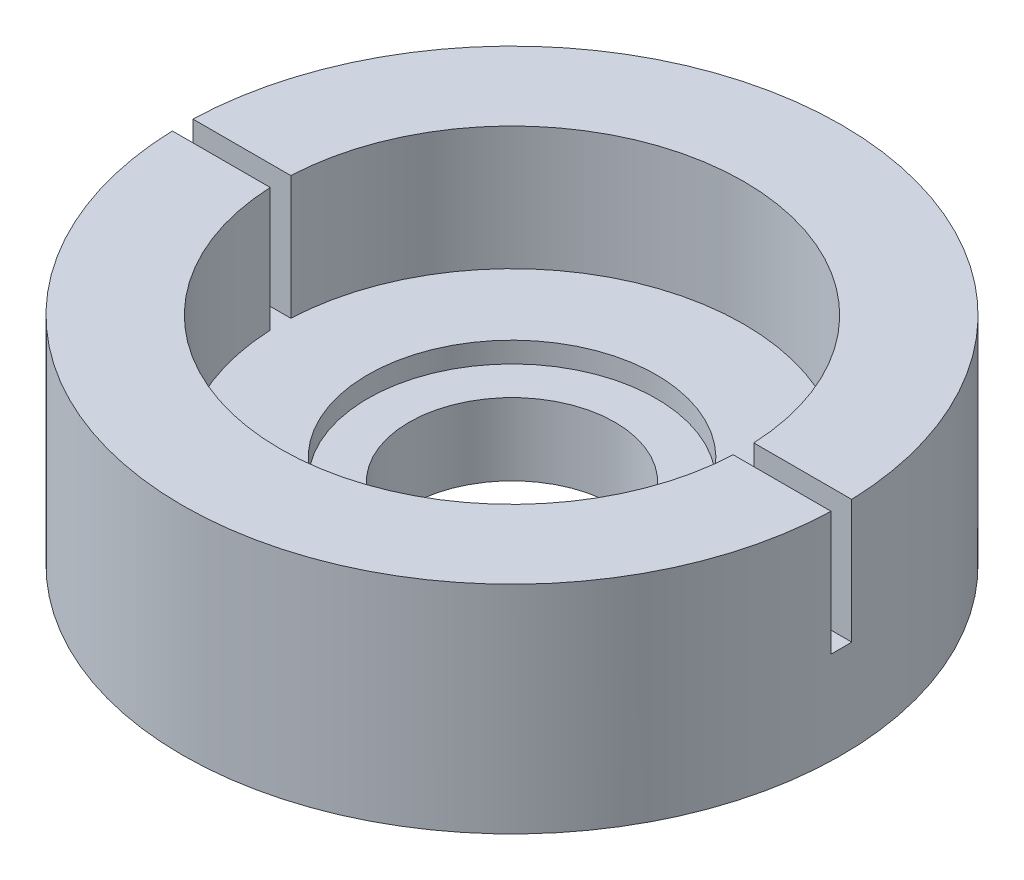
ISO-10303-21;
HEADER;
FILE_DESCRIPTION(('STEP AP214'),'2;1');
FILE_NAME('part.step','',(''),(''),'','','');
FILE_SCHEMA(('AUTOMOTIVE_DESIGN { 1 0 10303 214 1 1 1 1 }'));
ENDSEC;
DATA;
#1=APPLICATION_CONTEXT('core data for automotive mechanical design processes');
#2=APPLICATION_PROTOCOL_DEFINITION('international standard','automotive_design',2000,#1);
#3=PRODUCT_CONTEXT('',#1,'mechanical');
#4=PRODUCT('Part','Part','',(#3));
#5=PRODUCT_RELATED_PRODUCT_CATEGORY('part','',(#4));
#6=PRODUCT_DEFINITION_FORMATION('','',#4);
#7=PRODUCT_DEFINITION_CONTEXT('part definition',#1,'design');
#8=PRODUCT_DEFINITION('design','',#6,#7);
#9=PRODUCT_DEFINITION_SHAPE('','',#8);
#10=(LENGTH_UNIT() NAMED_UNIT(*) SI_UNIT(.MILLI.,.METRE.));
#11=(NAMED_UNIT(*) PLANE_ANGLE_UNIT() SI_UNIT($,.RADIAN.));
#12=(NAMED_UNIT(*) SI_UNIT($,.STERADIAN.) SOLID_ANGLE_UNIT());
#13=UNCERTAINTY_MEASURE_WITH_UNIT(LENGTH_MEASURE(1.E-05),#10,'distance_accuracy_value','');
#14=(GEOMETRIC_REPRESENTATION_CONTEXT(3) GLOBAL_UNCERTAINTY_ASSIGNED_CONTEXT((#13)) GLOBAL_UNIT_ASSIGNED_CONTEXT((#10,
#11,#12)) REPRESENTATION_CONTEXT('',''));
#15=CARTESIAN_POINT('',(0.,0.,0.));
#16=DIRECTION('',(0.,0.,1.));
#17=DIRECTION('',(1.,0.,0.));
#18=AXIS2_PLACEMENT_3D('',#15,#16,#17);
#19=CARTESIAN_POINT('',(0.,10.5,0.));
#20=DIRECTION('',(0.,1.,0.));
#21=DIRECTION('',(0.,0.,1.));
#22=AXIS2_PLACEMENT_3D('',#19,#20,#21);
#23=PLANE('',#22);
#24=DIRECTION('',(1.,0.,0.));
#25=VECTOR('',#24,1.);
#26=CARTESIAN_POINT('',(-16.,10.5,0.5));
#27=LINE('',#26,#25);
#28=CARTESIAN_POINT('',(-15.9921855917195,10.5,0.5));
#29=VERTEX_POINT('',#28);
#30=CARTESIAN_POINT('',(-11.2388833964945,10.5,0.5));
#31=VERTEX_POINT('',#30);
#32=EDGE_CURVE('E191',#29,#31,#27,.T.);
#33=ORIENTED_EDGE('',*,*,#32,.F.);
#34=CARTESIAN_POINT('',(0.,10.5,0.));
#35=DIRECTION('',(0.,1.,0.));
#36=DIRECTION('',(0.,0.,1.));
#37=AXIS2_PLACEMENT_3D('',#34,#35,#36);
#38=CIRCLE('',#37,16.);
#39=CARTESIAN_POINT('',(15.9921855917195,10.5,0.5));
#40=VERTEX_POINT('',#39);
#41=EDGE_CURVE('E131',#29,#40,#38,.T.);
#42=ORIENTED_EDGE('',*,*,#41,.T.);
#43=CARTESIAN_POINT('',(11.2388833964945,10.5,0.5));
#44=VERTEX_POINT('',#43);
#45=EDGE_CURVE('E193',#44,#40,#27,.T.);
#46=ORIENTED_EDGE('',*,*,#45,.F.);
#47=CARTESIAN_POINT('',(0.,10.5,0.));
#48=DIRECTION('',(0.,1.,0.));
#49=DIRECTION('',(0.,0.,1.));
#50=AXIS2_PLACEMENT_3D('',#47,#48,#49);
#51=CIRCLE('',#50,11.25);
#52=EDGE_CURVE('E123',#31,#44,#51,.T.);
#53=ORIENTED_EDGE('',*,*,#52,.F.);
#54=EDGE_LOOP('',(#33,#42,#46,#53));
#55=FACE_BOUND('',#54,.T.);
#56=ADVANCED_FACE('F33',(#55),#23,.T.);
#57=CARTESIAN_POINT('',(0.,10.5,0.));
#58=DIRECTION('',(0.,-1.,0.));
#59=DIRECTION('',(0.,0.,-1.));
#60=AXIS2_PLACEMENT_3D('',#57,#58,#59);
#61=CYLINDRICAL_SURFACE('',#60,11.25);
#62=DIRECTION('',(0.,-1.,0.));
#63=VECTOR('',#62,1.);
#64=CARTESIAN_POINT('',(-11.2388833964945,10.5,0.5));
#65=LINE('',#64,#63);
#66=CARTESIAN_POINT('',(-11.2388833964945,4.5,0.5));
#67=VERTEX_POINT('',#66);
#68=EDGE_CURVE('E173',#31,#67,#65,.T.);
#69=ORIENTED_EDGE('',*,*,#68,.F.);
#70=ORIENTED_EDGE('',*,*,#52,.T.);
#71=DIRECTION('',(0.,-1.,0.));
#72=VECTOR('',#71,1.);
#73=CARTESIAN_POINT('',(11.2388833964945,10.5,0.5));
#74=LINE('',#73,#72);
#75=CARTESIAN_POINT('',(11.2388833964945,4.5,0.5));
#76=VERTEX_POINT('',#75);
#77=EDGE_CURVE('E175',#76,#44,#74,.F.);
#78=ORIENTED_EDGE('',*,*,#77,.F.);
#79=CARTESIAN_POINT('',(0.,4.5,0.));
#80=DIRECTION('',(0.,1.,0.));
#81=DIRECTION('',(0.,0.,1.));
#82=AXIS2_PLACEMENT_3D('',#79,#80,#81);
#83=CIRCLE('',#82,11.25);
#84=EDGE_CURVE('E37',#76,#67,#83,.F.);
#85=ORIENTED_EDGE('',*,*,#84,.T.);
#86=EDGE_LOOP('',(#69,#70,#78,#85));
#87=FACE_BOUND('',#86,.T.);
#88=ADVANCED_FACE('F172',(#87),#61,.F.);
#89=CARTESIAN_POINT('',(0.,0.,0.));
#90=DIRECTION('',(0.,1.,0.));
#91=DIRECTION('',(0.,0.,1.));
#92=AXIS2_PLACEMENT_3D('',#89,#90,#91);
#93=PLANE('',#92);
#94=CARTESIAN_POINT('',(0.,0.,0.));
#95=DIRECTION('',(0.,1.,0.));
#96=DIRECTION('',(0.,0.,1.));
#97=AXIS2_PLACEMENT_3D('',#94,#95,#96);
#98=CIRCLE('',#97,16.);
#99=CARTESIAN_POINT('',(0.,0.,16.));
#100=VERTEX_POINT('',#99);
#101=EDGE_CURVE('E165',#100,#100,#98,.T.);
#102=ORIENTED_EDGE('',*,*,#101,.F.);
#103=EDGE_LOOP('',(#102));
#104=FACE_BOUND('',#103,.T.);
#105=CARTESIAN_POINT('',(0.,0.,0.));
#106=DIRECTION('',(0.,1.,0.));
#107=DIRECTION('',(0.,0.,1.));
#108=AXIS2_PLACEMENT_3D('',#105,#106,#107);
#109=CIRCLE('',#108,5.);
#110=CARTESIAN_POINT('',(0.,0.,5.));
#111=VERTEX_POINT('',#110);
#112=EDGE_CURVE('E159',#111,#111,#109,.T.);
#113=ORIENTED_EDGE('',*,*,#112,.T.);
#114=EDGE_LOOP('',(#113));
#115=FACE_BOUND('',#114,.T.);
#116=CARTESIAN_POINT('',(0.,0.,-12.5));
#117=DIRECTION('',(0.,1.,0.));
#118=DIRECTION('',(0.,0.,1.));
#119=AXIS2_PLACEMENT_3D('',#116,#117,#118);
#120=CIRCLE('',#119,1.975);
#121=CARTESIAN_POINT('',(0.,0.,-10.525));
#122=VERTEX_POINT('',#121);
#123=EDGE_CURVE('E154',#122,#122,#120,.T.);
#124=ORIENTED_EDGE('',*,*,#123,.T.);
#125=EDGE_LOOP('',(#124));
#126=FACE_BOUND('',#125,.T.);
#127=CARTESIAN_POINT('',(12.5,0.,0.));
#128=DIRECTION('',(0.,1.,0.));
#129=DIRECTION('',(0.,0.,1.));
#130=AXIS2_PLACEMENT_3D('',#127,#128,#129);
#131=CIRCLE('',#130,1.975);
#132=CARTESIAN_POINT('',(12.5,0.,1.975));
#133=VERTEX_POINT('',#132);
#134=EDGE_CURVE('E149',#133,#133,#131,.T.);
#135=ORIENTED_EDGE('',*,*,#134,.T.);
#136=EDGE_LOOP('',(#135));
#137=FACE_BOUND('',#136,.T.);
#138=CARTESIAN_POINT('',(0.,0.,12.5));
#139=DIRECTION('',(0.,1.,0.));
#140=DIRECTION('',(0.,0.,1.));
#141=AXIS2_PLACEMENT_3D('',#138,#139,#140);
#142=CIRCLE('',#141,1.975);
#143=CARTESIAN_POINT('',(0.,0.,14.475));
#144=VERTEX_POINT('',#143);
#145=EDGE_CURVE('E142',#144,#144,#142,.T.);
#146=ORIENTED_EDGE('',*,*,#145,.T.);
#147=EDGE_LOOP('',(#146));
#148=FACE_BOUND('',#147,.T.);
#149=CARTESIAN_POINT('',(-12.5,0.,0.));
#150=DIRECTION('',(0.,1.,0.));
#151=DIRECTION('',(0.,0.,1.));
#152=AXIS2_PLACEMENT_3D('',#149,#150,#151);
#153=CIRCLE('',#152,1.975);
#154=CARTESIAN_POINT('',(-12.5,0.,1.975));
#155=VERTEX_POINT('',#154);
#156=EDGE_CURVE('E139',#155,#155,#153,.T.);
#157=ORIENTED_EDGE('',*,*,#156,.T.);
#158=EDGE_LOOP('',(#157));
#159=FACE_BOUND('',#158,.T.);
#160=ADVANCED_FACE('F223',(#104,#115,#126,#137,#148,#159),#93,.F.);
#161=CARTESIAN_POINT('',(0.,3.5,0.));
#162=DIRECTION('',(0.,-1.,0.));
#163=DIRECTION('',(0.,0.,-1.));
#164=AXIS2_PLACEMENT_3D('',#161,#162,#163);
#165=CYLINDRICAL_SURFACE('',#164,16.);
#166=CARTESIAN_POINT('',(0.,4.5,0.));
#167=DIRECTION('',(0.,1.,0.));
#168=DIRECTION('',(0.,0.,1.));
#169=AXIS2_PLACEMENT_3D('',#166,#167,#168);
#170=CIRCLE('',#169,16.);
#171=CARTESIAN_POINT('',(15.9921855917195,4.5,0.5));
#172=VERTEX_POINT('',#171);
#173=CARTESIAN_POINT('',(15.9921855917195,4.5,-0.5));
#174=VERTEX_POINT('',#173);
#175=EDGE_CURVE('E121',#172,#174,#170,.T.);
#176=ORIENTED_EDGE('',*,*,#175,.F.);
#177=DIRECTION('',(0.,-1.,0.));
#178=VECTOR('',#177,1.);
#179=CARTESIAN_POINT('',(15.9921855917195,3.5,0.5));
#180=LINE('',#179,#178);
#181=EDGE_CURVE('E124',#172,#40,#180,.F.);
#182=ORIENTED_EDGE('',*,*,#181,.T.);
#183=ORIENTED_EDGE('',*,*,#41,.F.);
#184=DIRECTION('',(0.,-1.,0.));
#185=VECTOR('',#184,1.);
#186=CARTESIAN_POINT('',(-15.9921855917195,3.5,0.5));
#187=LINE('',#186,#185);
#188=CARTESIAN_POINT('',(-15.9921855917195,4.5,0.5));
#189=VERTEX_POINT('',#188);
#190=EDGE_CURVE('E120',#29,#189,#187,.T.);
#191=ORIENTED_EDGE('',*,*,#190,.T.);
#192=CARTESIAN_POINT('',(-15.9921855917195,4.5,-0.5));
#193=VERTEX_POINT('',#192);
#194=EDGE_CURVE('E113',#193,#189,#170,.T.);
#195=ORIENTED_EDGE('',*,*,#194,.F.);
#196=DIRECTION('',(0.,-1.,0.));
#197=VECTOR('',#196,1.);
#198=CARTESIAN_POINT('',(-15.9921855917195,3.5,-0.5));
#199=LINE('',#198,#197);
#200=CARTESIAN_POINT('',(-15.9921855917195,10.5,-0.5));
#201=VERTEX_POINT('',#200);
#202=EDGE_CURVE('E98',#193,#201,#199,.F.);
#203=ORIENTED_EDGE('',*,*,#202,.T.);
#204=CARTESIAN_POINT('',(15.9921855917195,10.5,-0.5));
#205=VERTEX_POINT('',#204);
#206=EDGE_CURVE('E134',#205,#201,#38,.T.);
#207=ORIENTED_EDGE('',*,*,#206,.F.);
#208=DIRECTION('',(0.,-1.,0.));
#209=VECTOR('',#208,1.);
#210=CARTESIAN_POINT('',(15.9921855917195,3.5,-0.5));
#211=LINE('',#210,#209);
#212=EDGE_CURVE('E109',#205,#174,#211,.T.);
#213=ORIENTED_EDGE('',*,*,#212,.T.);
#214=EDGE_LOOP('',(#176,#182,#183,#191,#195,#203,#207,#213));
#215=FACE_BOUND('',#214,.T.);
#216=ORIENTED_EDGE('',*,*,#101,.T.);
#217=EDGE_LOOP('',(#216));
#218=FACE_BOUND('',#217,.T.);
#219=ADVANCED_FACE('F35',(#215,#218),#165,.T.);
#220=CARTESIAN_POINT('',(0.,3.5,0.));
#221=DIRECTION('',(0.,-1.,0.));
#222=DIRECTION('',(0.,0.,-1.));
#223=AXIS2_PLACEMENT_3D('',#220,#221,#222);
#224=CYLINDRICAL_SURFACE('',#223,5.);
#225=CARTESIAN_POINT('',(0.,3.5,0.));
#226=DIRECTION('',(0.,1.,0.));
#227=DIRECTION('',(0.,0.,1.));
#228=AXIS2_PLACEMENT_3D('',#225,#226,#227);
#229=CIRCLE('',#228,5.);
#230=CARTESIAN_POINT('',(0.,3.5,5.));
#231=VERTEX_POINT('',#230);
#232=EDGE_CURVE('E160',#231,#231,#229,.T.);
#233=ORIENTED_EDGE('',*,*,#232,.T.);
#234=EDGE_LOOP('',(#233));
#235=FACE_BOUND('',#234,.T.);
#236=ORIENTED_EDGE('',*,*,#112,.F.);
#237=EDGE_LOOP('',(#236));
#238=FACE_BOUND('',#237,.T.);
#239=ADVANCED_FACE('F274',(#235,#238),#224,.F.);
#240=CARTESIAN_POINT('',(0.,3.5,-12.5));
#241=DIRECTION('',(0.,-1.,0.));
#242=DIRECTION('',(0.,0.,-1.));
#243=AXIS2_PLACEMENT_3D('',#240,#241,#242);
#244=CYLINDRICAL_SURFACE('',#243,1.975);
#245=CARTESIAN_POINT('',(0.,3.5,-12.5));
#246=DIRECTION('',(0.,1.,0.));
#247=DIRECTION('',(0.,0.,1.));
#248=AXIS2_PLACEMENT_3D('',#245,#246,#247);
#249=CIRCLE('',#248,1.975);
#250=CARTESIAN_POINT('',(0.,3.5,-10.525));
#251=VERTEX_POINT('',#250);
#252=EDGE_CURVE('E146',#251,#251,#249,.T.);
#253=ORIENTED_EDGE('',*,*,#252,.T.);
#254=EDGE_LOOP('',(#253));
#255=FACE_BOUND('',#254,.T.);
#256=ORIENTED_EDGE('',*,*,#123,.F.);
#257=EDGE_LOOP('',(#256));
#258=FACE_BOUND('',#257,.T.);
#259=ADVANCED_FACE('F270',(#255,#258),#244,.F.);
#260=CARTESIAN_POINT('',(12.5,3.5,0.));
#261=DIRECTION('',(0.,-1.,0.));
#262=DIRECTION('',(0.,0.,-1.));
#263=AXIS2_PLACEMENT_3D('',#260,#261,#262);
#264=CYLINDRICAL_SURFACE('',#263,1.975);
#265=CARTESIAN_POINT('',(12.5,3.5,0.));
#266=DIRECTION('',(0.,1.,0.));
#267=DIRECTION('',(0.,0.,1.));
#268=AXIS2_PLACEMENT_3D('',#265,#266,#267);
#269=CIRCLE('',#268,1.975);
#270=CARTESIAN_POINT('',(12.5,3.5,1.975));
#271=VERTEX_POINT('',#270);
#272=EDGE_CURVE('E138',#271,#271,#269,.T.);
#273=ORIENTED_EDGE('',*,*,#272,.T.);
#274=EDGE_LOOP('',(#273));
#275=FACE_BOUND('',#274,.T.);
#276=ORIENTED_EDGE('',*,*,#134,.F.);
#277=EDGE_LOOP('',(#276));
#278=FACE_BOUND('',#277,.T.);
#279=ADVANCED_FACE('F266',(#275,#278),#264,.F.);
#280=CARTESIAN_POINT('',(0.,3.5,12.5));
#281=DIRECTION('',(0.,-1.,0.));
#282=DIRECTION('',(0.,0.,-1.));
#283=AXIS2_PLACEMENT_3D('',#280,#281,#282);
#284=CYLINDRICAL_SURFACE('',#283,1.975);
#285=CARTESIAN_POINT('',(0.,3.5,12.5));
#286=DIRECTION('',(0.,1.,0.));
#287=DIRECTION('',(0.,0.,1.));
#288=AXIS2_PLACEMENT_3D('',#285,#286,#287);
#289=CIRCLE('',#288,1.975);
#290=CARTESIAN_POINT('',(0.,3.5,14.475));
#291=VERTEX_POINT('',#290);
#292=EDGE_CURVE('E143',#291,#291,#289,.T.);
#293=ORIENTED_EDGE('',*,*,#292,.T.);
#294=EDGE_LOOP('',(#293));
#295=FACE_BOUND('',#294,.T.);
#296=ORIENTED_EDGE('',*,*,#145,.F.);
#297=EDGE_LOOP('',(#296));
#298=FACE_BOUND('',#297,.T.);
#299=ADVANCED_FACE('F262',(#295,#298),#284,.F.);
#300=CARTESIAN_POINT('',(-12.5,3.5,0.));
#301=DIRECTION('',(0.,-1.,0.));
#302=DIRECTION('',(0.,0.,-1.));
#303=AXIS2_PLACEMENT_3D('',#300,#301,#302);
#304=CYLINDRICAL_SURFACE('',#303,1.975);
#305=CARTESIAN_POINT('',(-12.5,3.5,0.));
#306=DIRECTION('',(0.,1.,0.));
#307=DIRECTION('',(0.,0.,1.));
#308=AXIS2_PLACEMENT_3D('',#305,#306,#307);
#309=CIRCLE('',#308,1.975);
#310=CARTESIAN_POINT('',(-12.5,3.5,1.975));
#311=VERTEX_POINT('',#310);
#312=EDGE_CURVE('E135',#311,#311,#309,.T.);
#313=ORIENTED_EDGE('',*,*,#312,.T.);
#314=EDGE_LOOP('',(#313));
#315=FACE_BOUND('',#314,.T.);
#316=ORIENTED_EDGE('',*,*,#156,.F.);
#317=EDGE_LOOP('',(#316));
#318=FACE_BOUND('',#317,.T.);
#319=ADVANCED_FACE('F259',(#315,#318),#304,.F.);
#320=CARTESIAN_POINT('',(0.,3.5,0.));
#321=DIRECTION('',(0.,1.,0.));
#322=DIRECTION('',(0.,0.,1.));
#323=AXIS2_PLACEMENT_3D('',#320,#321,#322);
#324=PLANE('',#323);
#325=ORIENTED_EDGE('',*,*,#312,.F.);
#326=EDGE_LOOP('',(#325));
#327=FACE_BOUND('',#326,.T.);
#328=ADVANCED_FACE('F217',(#327),#324,.F.);
#329=ORIENTED_EDGE('',*,*,#272,.F.);
#330=EDGE_LOOP('',(#329));
#331=FACE_BOUND('',#330,.T.);
#332=ADVANCED_FACE('F341',(#331),#324,.F.);
#333=ORIENTED_EDGE('',*,*,#252,.F.);
#334=EDGE_LOOP('',(#333));
#335=FACE_BOUND('',#334,.T.);
#336=ADVANCED_FACE('F214',(#335),#324,.F.);
#337=ORIENTED_EDGE('',*,*,#292,.F.);
#338=EDGE_LOOP('',(#337));
#339=FACE_BOUND('',#338,.T.);
#340=ADVANCED_FACE('F207',(#339),#324,.F.);
#341=DIRECTION('',(-1.,0.,0.));
#342=VECTOR('',#341,1.);
#343=CARTESIAN_POINT('',(-16.,10.5,-0.5));
#344=LINE('',#343,#342);
#345=CARTESIAN_POINT('',(11.2388833964945,10.5,-0.5));
#346=VERTEX_POINT('',#345);
#347=EDGE_CURVE('E195',#205,#346,#344,.T.);
#348=ORIENTED_EDGE('',*,*,#347,.F.);
#349=ORIENTED_EDGE('',*,*,#206,.T.);
#350=CARTESIAN_POINT('',(-11.2388833964945,10.5,-0.5));
#351=VERTEX_POINT('',#350);
#352=EDGE_CURVE('E104',#351,#201,#344,.T.);
#353=ORIENTED_EDGE('',*,*,#352,.F.);
#354=EDGE_CURVE('E130',#346,#351,#51,.T.);
#355=ORIENTED_EDGE('',*,*,#354,.F.);
#356=EDGE_LOOP('',(#348,#349,#353,#355));
#357=FACE_BOUND('',#356,.T.);
#358=ADVANCED_FACE('F205',(#357),#23,.T.);
#359=DIRECTION('',(0.,-1.,0.));
#360=VECTOR('',#359,1.);
#361=CARTESIAN_POINT('',(11.2388833964945,10.5,-0.5));
#362=LINE('',#361,#360);
#363=CARTESIAN_POINT('',(11.2388833964945,4.5,-0.5));
#364=VERTEX_POINT('',#363);
#365=EDGE_CURVE('E110',#346,#364,#362,.T.);
#366=ORIENTED_EDGE('',*,*,#365,.F.);
#367=ORIENTED_EDGE('',*,*,#354,.T.);
#368=DIRECTION('',(0.,-1.,0.));
#369=VECTOR('',#368,1.);
#370=CARTESIAN_POINT('',(-11.2388833964945,10.5,-0.5));
#371=LINE('',#370,#369);
#372=CARTESIAN_POINT('',(-11.2388833964945,4.5,-0.5));
#373=VERTEX_POINT('',#372);
#374=EDGE_CURVE('E114',#373,#351,#371,.F.);
#375=ORIENTED_EDGE('',*,*,#374,.F.);
#376=EDGE_CURVE('E11',#373,#364,#83,.F.);
#377=ORIENTED_EDGE('',*,*,#376,.T.);
#378=EDGE_LOOP('',(#366,#367,#375,#377));
#379=FACE_BOUND('',#378,.T.);
#380=ADVANCED_FACE('F203',(#379),#61,.F.);
#381=CARTESIAN_POINT('',(0.,4.5,0.));
#382=DIRECTION('',(0.,1.,0.));
#383=DIRECTION('',(0.,0.,1.));
#384=AXIS2_PLACEMENT_3D('',#381,#382,#383);
#385=PLANE('',#384);
#386=CARTESIAN_POINT('',(0.,4.5,0.));
#387=DIRECTION('',(0.,1.,0.));
#388=DIRECTION('',(0.,0.,1.));
#389=AXIS2_PLACEMENT_3D('',#386,#387,#388);
#390=CIRCLE('',#389,7.);
#391=CARTESIAN_POINT('',(0.,4.5,7.));
#392=VERTEX_POINT('',#391);
#393=EDGE_CURVE('E247',#392,#392,#390,.T.);
#394=ORIENTED_EDGE('',*,*,#393,.F.);
#395=EDGE_LOOP('',(#394));
#396=FACE_BOUND('',#395,.T.);
#397=ORIENTED_EDGE('',*,*,#376,.F.);
#398=DIRECTION('',(1.,0.,0.));
#399=VECTOR('',#398,1.);
#400=CARTESIAN_POINT('',(-16.,4.5,-0.5));
#401=LINE('',#400,#399);
#402=EDGE_CURVE('E101',#193,#373,#401,.T.);
#403=ORIENTED_EDGE('',*,*,#402,.F.);
#404=ORIENTED_EDGE('',*,*,#194,.T.);
#405=DIRECTION('',(-1.,0.,0.));
#406=VECTOR('',#405,1.);
#407=CARTESIAN_POINT('',(-16.,4.5,0.5));
#408=LINE('',#407,#406);
#409=EDGE_CURVE('E55',#67,#189,#408,.T.);
#410=ORIENTED_EDGE('',*,*,#409,.F.);
#411=ORIENTED_EDGE('',*,*,#84,.F.);
#412=EDGE_CURVE('E177',#172,#76,#408,.T.);
#413=ORIENTED_EDGE('',*,*,#412,.F.);
#414=ORIENTED_EDGE('',*,*,#175,.T.);
#415=EDGE_CURVE('E48',#364,#174,#401,.T.);
#416=ORIENTED_EDGE('',*,*,#415,.F.);
#417=EDGE_LOOP('',(#397,#403,#404,#410,#411,#413,#414,#416));
#418=FACE_BOUND('',#417,.T.);
#419=ADVANCED_FACE('F112',(#396,#418),#385,.T.);
#420=CARTESIAN_POINT('',(-16.,-27.5156211871642,-0.5));
#421=DIRECTION('',(0.,0.,-1.));
#422=DIRECTION('',(-1.,0.,0.));
#423=AXIS2_PLACEMENT_3D('',#420,#421,#422);
#424=PLANE('',#423);
#425=ORIENTED_EDGE('',*,*,#402,.T.);
#426=ORIENTED_EDGE('',*,*,#374,.T.);
#427=ORIENTED_EDGE('',*,*,#352,.T.);
#428=ORIENTED_EDGE('',*,*,#202,.F.);
#429=EDGE_LOOP('',(#425,#426,#427,#428));
#430=FACE_BOUND('',#429,.T.);
#431=ADVANCED_FACE('F100',(#430),#424,.F.);
#432=CARTESIAN_POINT('',(-16.,-27.5156211871642,0.5));
#433=DIRECTION('',(0.,0.,1.));
#434=DIRECTION('',(1.,0.,0.));
#435=AXIS2_PLACEMENT_3D('',#432,#433,#434);
#436=PLANE('',#435);
#437=ORIENTED_EDGE('',*,*,#32,.T.);
#438=ORIENTED_EDGE('',*,*,#68,.T.);
#439=ORIENTED_EDGE('',*,*,#409,.T.);
#440=ORIENTED_EDGE('',*,*,#190,.F.);
#441=EDGE_LOOP('',(#437,#438,#439,#440));
#442=FACE_BOUND('',#441,.T.);
#443=ADVANCED_FACE('F189',(#442),#436,.F.);
#444=ORIENTED_EDGE('',*,*,#412,.T.);
#445=ORIENTED_EDGE('',*,*,#77,.T.);
#446=ORIENTED_EDGE('',*,*,#45,.T.);
#447=ORIENTED_EDGE('',*,*,#181,.F.);
#448=EDGE_LOOP('',(#444,#445,#446,#447));
#449=FACE_BOUND('',#448,.T.);
#450=ADVANCED_FACE('F232',(#449),#436,.F.);
#451=ORIENTED_EDGE('',*,*,#347,.T.);
#452=ORIENTED_EDGE('',*,*,#365,.T.);
#453=ORIENTED_EDGE('',*,*,#415,.T.);
#454=ORIENTED_EDGE('',*,*,#212,.F.);
#455=EDGE_LOOP('',(#451,#452,#453,#454));
#456=FACE_BOUND('',#455,.T.);
#457=ADVANCED_FACE('F199',(#456),#424,.F.);
#458=CARTESIAN_POINT('',(0.,3.5,0.));
#459=DIRECTION('',(0.,1.,0.));
#460=DIRECTION('',(0.,0.,1.));
#461=AXIS2_PLACEMENT_3D('',#458,#459,#460);
#462=CYLINDRICAL_SURFACE('',#461,7.);
#463=CARTESIAN_POINT('',(0.,3.5,0.));
#464=DIRECTION('',(0.,1.,0.));
#465=DIRECTION('',(0.,0.,1.));
#466=AXIS2_PLACEMENT_3D('',#463,#464,#465);
#467=CIRCLE('',#466,7.);
#468=CARTESIAN_POINT('',(0.,3.5,7.));
#469=VERTEX_POINT('',#468);
#470=EDGE_CURVE('E163',#469,#469,#467,.T.);
#471=ORIENTED_EDGE('',*,*,#470,.F.);
#472=EDGE_LOOP('',(#471));
#473=FACE_BOUND('',#472,.T.);
#474=ORIENTED_EDGE('',*,*,#393,.T.);
#475=EDGE_LOOP('',(#474));
#476=FACE_BOUND('',#475,.T.);
#477=ADVANCED_FACE('F231',(#473,#476),#462,.F.);
#478=CARTESIAN_POINT('',(0.,3.5,0.));
#479=DIRECTION('',(0.,1.,0.));
#480=DIRECTION('',(0.,0.,1.));
#481=AXIS2_PLACEMENT_3D('',#478,#479,#480);
#482=PLANE('',#481);
#483=ORIENTED_EDGE('',*,*,#232,.F.);
#484=EDGE_LOOP('',(#483));
#485=FACE_BOUND('',#484,.T.);
#486=ORIENTED_EDGE('',*,*,#470,.T.);
#487=EDGE_LOOP('',(#486));
#488=FACE_BOUND('',#487,.T.);
#489=ADVANCED_FACE('F237',(#485,#488),#482,.T.);
#490=CLOSED_SHELL('',(#56,#88,#160,#219,#239,#259,#279,#299,#319,#328,#332,#336,#340,#358,#380,
#419,#431,#443,#450,#457,#477,#489));
#491=MANIFOLD_SOLID_BREP('B2',#490);
#492=ADVANCED_BREP_SHAPE_REPRESENTATION('',(#18,#491),#14);
#493=SHAPE_DEFINITION_REPRESENTATION(#9,#492);
ENDSEC;
END-ISO-10303-21;
